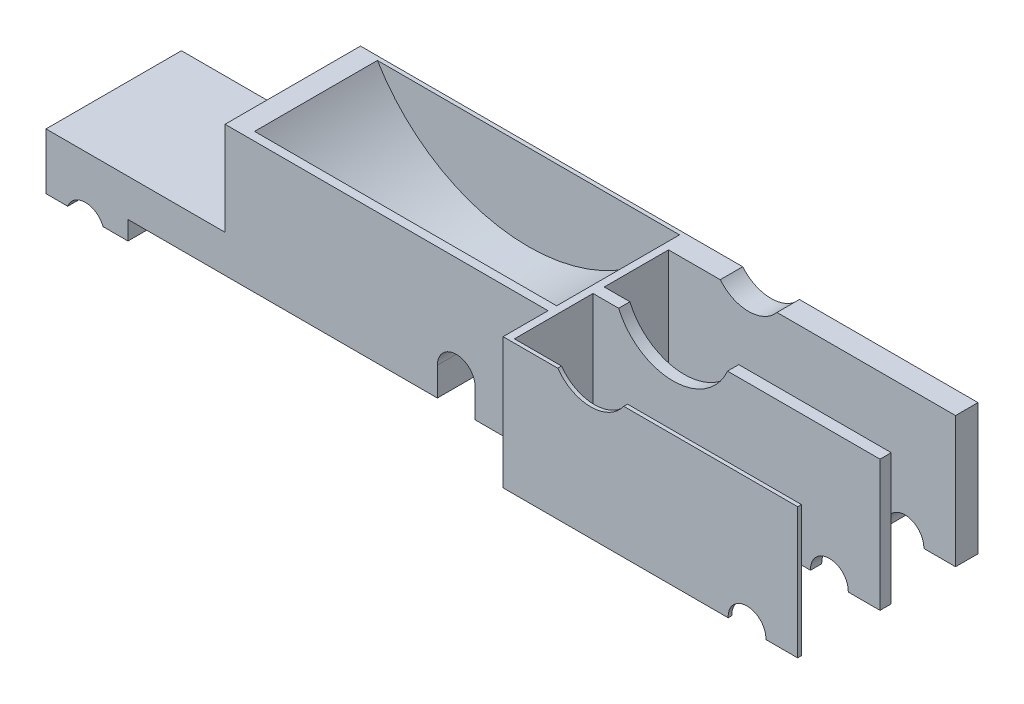
ISO-10303-21;
HEADER;
FILE_DESCRIPTION(('STEP AP214'),'2;1');
FILE_NAME('part.step','',(''),(''),'','','');
FILE_SCHEMA(('AUTOMOTIVE_DESIGN { 1 0 10303 214 1 1 1 1 }'));
ENDSEC;
DATA;
#1=APPLICATION_CONTEXT('core data for automotive mechanical design processes');
#2=APPLICATION_PROTOCOL_DEFINITION('international standard','automotive_design',2000,#1);
#3=PRODUCT_CONTEXT('',#1,'mechanical');
#4=PRODUCT('Part','Part','',(#3));
#5=PRODUCT_RELATED_PRODUCT_CATEGORY('part','',(#4));
#6=PRODUCT_DEFINITION_FORMATION('','',#4);
#7=PRODUCT_DEFINITION_CONTEXT('part definition',#1,'design');
#8=PRODUCT_DEFINITION('design','',#6,#7);
#9=PRODUCT_DEFINITION_SHAPE('','',#8);
#10=(LENGTH_UNIT() NAMED_UNIT(*) SI_UNIT(.MILLI.,.METRE.));
#11=(NAMED_UNIT(*) PLANE_ANGLE_UNIT() SI_UNIT($,.RADIAN.));
#12=(NAMED_UNIT(*) SI_UNIT($,.STERADIAN.) SOLID_ANGLE_UNIT());
#13=UNCERTAINTY_MEASURE_WITH_UNIT(LENGTH_MEASURE(1.E-05),#10,'distance_accuracy_value','');
#14=(GEOMETRIC_REPRESENTATION_CONTEXT(3) GLOBAL_UNCERTAINTY_ASSIGNED_CONTEXT((#13)) GLOBAL_UNIT_ASSIGNED_CONTEXT((#10,
#11,#12)) REPRESENTATION_CONTEXT('',''));
#15=CARTESIAN_POINT('',(0.,0.,0.));
#16=DIRECTION('',(0.,0.,1.));
#17=DIRECTION('',(1.,0.,0.));
#18=AXIS2_PLACEMENT_3D('',#15,#16,#17);
#19=CARTESIAN_POINT('',(0.,0.,0.));
#20=DIRECTION('',(0.,-1.,0.));
#21=DIRECTION('',(0.,0.,-1.));
#22=AXIS2_PLACEMENT_3D('',#19,#20,#21);
#23=PLANE('',#22);
#24=DIRECTION('',(0.,0.,-1.));
#25=VECTOR('',#24,1.);
#26=CARTESIAN_POINT('',(371.919967655531,0.,-11.94308));
#27=LINE('',#26,#25);
#28=CARTESIAN_POINT('',(371.919967655531,0.,-11.94308));
#29=VERTEX_POINT('',#28);
#30=CARTESIAN_POINT('',(371.919967655531,0.,-14.48308));
#31=VERTEX_POINT('',#30);
#32=EDGE_CURVE('E342',#29,#31,#27,.T.);
#33=ORIENTED_EDGE('',*,*,#32,.F.);
#34=DIRECTION('',(1.,0.,0.));
#35=VECTOR('',#34,1.);
#36=CARTESIAN_POINT('',(0.,0.,-11.94308));
#37=LINE('',#36,#35);
#38=CARTESIAN_POINT('',(219.202,0.,-11.94308));
#39=VERTEX_POINT('',#38);
#40=EDGE_CURVE('E432',#39,#29,#37,.T.);
#41=ORIENTED_EDGE('',*,*,#40,.F.);
#42=DIRECTION('',(0.,0.,1.));
#43=VECTOR('',#42,1.);
#44=CARTESIAN_POINT('',(219.202,0.,-42.42308));
#45=LINE('',#44,#43);
#46=CARTESIAN_POINT('',(219.202,0.,-42.42308));
#47=VERTEX_POINT('',#46);
#48=EDGE_CURVE('E422',#47,#39,#45,.T.);
#49=ORIENTED_EDGE('',*,*,#48,.F.);
#50=DIRECTION('',(1.,0.,0.));
#51=VECTOR('',#50,1.);
#52=CARTESIAN_POINT('',(0.,0.,-42.42308));
#53=LINE('',#52,#51);
#54=CARTESIAN_POINT('',(169.736021606867,0.,-42.42308));
#55=VERTEX_POINT('',#54);
#56=EDGE_CURVE('E410',#55,#47,#53,.T.);
#57=ORIENTED_EDGE('',*,*,#56,.F.);
#58=DIRECTION('',(0.,0.,-1.));
#59=VECTOR('',#58,1.);
#60=CARTESIAN_POINT('',(169.736021606867,0.,-11.94308));
#61=LINE('',#60,#59);
#62=CARTESIAN_POINT('',(169.736021606867,0.,-134.33298));
#63=VERTEX_POINT('',#62);
#64=EDGE_CURVE('E640',#55,#63,#61,.T.);
#65=ORIENTED_EDGE('',*,*,#64,.T.);
#66=DIRECTION('',(-1.,0.,0.));
#67=VECTOR('',#66,1.);
#68=CARTESIAN_POINT('',(419.1,0.,-134.33298));
#69=LINE('',#68,#67);
#70=CARTESIAN_POINT('',(371.919967655531,0.,-134.33298));
#71=VERTEX_POINT('',#70);
#72=EDGE_CURVE('E452',#71,#63,#69,.T.);
#73=ORIENTED_EDGE('',*,*,#72,.F.);
#74=CARTESIAN_POINT('',(371.919967655531,0.,-119.09298));
#75=VERTEX_POINT('',#74);
#76=EDGE_CURVE('E69',#75,#71,#27,.T.);
#77=ORIENTED_EDGE('',*,*,#76,.F.);
#78=DIRECTION('',(-1.,0.,0.));
#79=VECTOR('',#78,1.);
#80=CARTESIAN_POINT('',(419.1,0.,-119.09298));
#81=LINE('',#80,#79);
#82=CARTESIAN_POINT('',(224.319280820751,0.,-119.09298));
#83=VERTEX_POINT('',#82);
#84=EDGE_CURVE('E505',#75,#83,#81,.T.);
#85=ORIENTED_EDGE('',*,*,#84,.T.);
#86=DIRECTION('',(0.,0.,1.));
#87=VECTOR('',#86,1.);
#88=CARTESIAN_POINT('',(224.319280820751,0.,-119.09298));
#89=LINE('',#88,#87);
#90=CARTESIAN_POINT('',(224.319280820751,0.,-75.45324));
#91=VERTEX_POINT('',#90);
#92=EDGE_CURVE('E504',#83,#91,#89,.T.);
#93=ORIENTED_EDGE('',*,*,#92,.T.);
#94=DIRECTION('',(1.,0.,0.));
#95=VECTOR('',#94,1.);
#96=CARTESIAN_POINT('',(224.319280820751,0.,-75.45324));
#97=LINE('',#96,#95);
#98=CARTESIAN_POINT('',(371.919967655531,0.,-75.45324));
#99=VERTEX_POINT('',#98);
#100=EDGE_CURVE('E510',#91,#99,#97,.T.);
#101=ORIENTED_EDGE('',*,*,#100,.T.);
#102=CARTESIAN_POINT('',(371.919967655531,0.,-67.83324));
#103=VERTEX_POINT('',#102);
#104=EDGE_CURVE('E61',#103,#99,#27,.T.);
#105=ORIENTED_EDGE('',*,*,#104,.F.);
#106=DIRECTION('',(-1.,0.,0.));
#107=VECTOR('',#106,1.);
#108=CARTESIAN_POINT('',(419.1,0.,-67.83324));
#109=LINE('',#108,#107);
#110=CARTESIAN_POINT('',(224.319280820751,0.,-67.83324));
#111=VERTEX_POINT('',#110);
#112=EDGE_CURVE('E546',#103,#111,#109,.T.);
#113=ORIENTED_EDGE('',*,*,#112,.T.);
#114=DIRECTION('',(0.,0.,1.));
#115=VECTOR('',#114,1.);
#116=CARTESIAN_POINT('',(224.319280820751,0.,-67.83324));
#117=LINE('',#116,#115);
#118=CARTESIAN_POINT('',(224.319280820751,0.,-14.48308));
#119=VERTEX_POINT('',#118);
#120=EDGE_CURVE('E580',#111,#119,#117,.T.);
#121=ORIENTED_EDGE('',*,*,#120,.T.);
#122=DIRECTION('',(1.,0.,0.));
#123=VECTOR('',#122,1.);
#124=CARTESIAN_POINT('',(224.319280820751,0.,-14.48308));
#125=LINE('',#124,#123);
#126=EDGE_CURVE('E576',#119,#31,#125,.T.);
#127=ORIENTED_EDGE('',*,*,#126,.T.);
#128=EDGE_LOOP('',(#33,#41,#49,#57,#65,#73,#77,#85,#93,#101,#105,#113,#121,#127));
#129=FACE_BOUND('',#128,.T.);
#130=ADVANCED_FACE('F45',(#129),#23,.T.);
#131=DIRECTION('',(0.,0.,-1.));
#132=VECTOR('',#131,1.);
#133=CARTESIAN_POINT('',(397.551903334925,0.,-11.94308));
#134=LINE('',#133,#132);
#135=CARTESIAN_POINT('',(397.551903334925,0.,-134.33298));
#136=VERTEX_POINT('',#135);
#137=CARTESIAN_POINT('',(397.551903334925,0.,-119.09298));
#138=VERTEX_POINT('',#137);
#139=EDGE_CURVE('E334',#136,#138,#134,.F.);
#140=ORIENTED_EDGE('',*,*,#139,.F.);
#141=CARTESIAN_POINT('',(419.1,0.,-134.33298));
#142=VERTEX_POINT('',#141);
#143=EDGE_CURVE('E447',#142,#136,#69,.T.);
#144=ORIENTED_EDGE('',*,*,#143,.F.);
#145=DIRECTION('',(0.,0.,-1.));
#146=VECTOR('',#145,1.);
#147=CARTESIAN_POINT('',(419.1,0.,0.));
#148=LINE('',#147,#146);
#149=CARTESIAN_POINT('',(419.1,0.,-119.09298));
#150=VERTEX_POINT('',#149);
#151=EDGE_CURVE('E588',#150,#142,#148,.T.);
#152=ORIENTED_EDGE('',*,*,#151,.F.);
#153=EDGE_CURVE('E500',#150,#138,#81,.T.);
#154=ORIENTED_EDGE('',*,*,#153,.T.);
#155=EDGE_LOOP('',(#140,#144,#152,#154));
#156=FACE_BOUND('',#155,.T.);
#157=ADVANCED_FACE('F734',(#156),#23,.T.);
#158=CARTESIAN_POINT('',(397.551903334925,0.,-75.45324));
#159=VERTEX_POINT('',#158);
#160=CARTESIAN_POINT('',(397.551903334925,0.,-67.83324));
#161=VERTEX_POINT('',#160);
#162=EDGE_CURVE('E338',#159,#161,#134,.F.);
#163=ORIENTED_EDGE('',*,*,#162,.F.);
#164=CARTESIAN_POINT('',(419.1,0.,-75.45324));
#165=VERTEX_POINT('',#164);
#166=EDGE_CURVE('E509',#159,#165,#97,.T.);
#167=ORIENTED_EDGE('',*,*,#166,.T.);
#168=CARTESIAN_POINT('',(419.1,0.,-67.83324));
#169=VERTEX_POINT('',#168);
#170=EDGE_CURVE('E606',#169,#165,#148,.T.);
#171=ORIENTED_EDGE('',*,*,#170,.F.);
#172=EDGE_CURVE('E571',#169,#161,#109,.T.);
#173=ORIENTED_EDGE('',*,*,#172,.T.);
#174=EDGE_LOOP('',(#163,#167,#171,#173));
#175=FACE_BOUND('',#174,.T.);
#176=ADVANCED_FACE('F717',(#175),#23,.T.);
#177=DIRECTION('',(0.,0.,-1.));
#178=VECTOR('',#177,1.);
#179=CARTESIAN_POINT('',(144.082021606867,0.,-11.94308));
#180=LINE('',#179,#178);
#181=CARTESIAN_POINT('',(144.082021606867,0.,-42.42308));
#182=VERTEX_POINT('',#181);
#183=CARTESIAN_POINT('',(144.082021606867,0.,-134.33298));
#184=VERTEX_POINT('',#183);
#185=EDGE_CURVE('E302',#182,#184,#180,.T.);
#186=ORIENTED_EDGE('',*,*,#185,.F.);
#187=CARTESIAN_POINT('',(-65.8864784217989,0.,-42.42308));
#188=VERTEX_POINT('',#187);
#189=EDGE_CURVE('E411',#188,#182,#53,.T.);
#190=ORIENTED_EDGE('',*,*,#189,.F.);
#191=DIRECTION('',(0.,0.,1.));
#192=VECTOR('',#191,1.);
#193=CARTESIAN_POINT('',(-65.8864784217989,0.,-42.42308));
#194=LINE('',#193,#192);
#195=CARTESIAN_POINT('',(-65.8864784217989,0.,-134.33298));
#196=VERTEX_POINT('',#195);
#197=EDGE_CURVE('E358',#196,#188,#194,.T.);
#198=ORIENTED_EDGE('',*,*,#197,.F.);
#199=EDGE_CURVE('E446',#184,#196,#69,.T.);
#200=ORIENTED_EDGE('',*,*,#199,.F.);
#201=EDGE_LOOP('',(#186,#190,#198,#200));
#202=FACE_BOUND('',#201,.T.);
#203=ADVANCED_FACE('F637',(#202),#23,.T.);
#204=CARTESIAN_POINT('',(0.,-12.7,0.));
#205=DIRECTION('',(0.,-1.,0.));
#206=DIRECTION('',(0.,0.,-1.));
#207=AXIS2_PLACEMENT_3D('',#204,#205,#206);
#208=PLANE('',#207);
#209=DIRECTION('',(0.,0.,-1.));
#210=VECTOR('',#209,1.);
#211=CARTESIAN_POINT('',(-106.78265671688,-12.7,-11.94308));
#212=LINE('',#211,#210);
#213=CARTESIAN_POINT('',(-106.78265671688,-12.7,-42.42308));
#214=VERTEX_POINT('',#213);
#215=CARTESIAN_POINT('',(-106.78265671688,-12.7,-134.33298));
#216=VERTEX_POINT('',#215);
#217=EDGE_CURVE('E627',#214,#216,#212,.T.);
#218=ORIENTED_EDGE('',*,*,#217,.F.);
#219=DIRECTION('',(-1.,0.,0.));
#220=VECTOR('',#219,1.);
#221=CARTESIAN_POINT('',(-121.533574186181,-12.7,-42.42308));
#222=LINE('',#221,#220);
#223=CARTESIAN_POINT('',(-121.533574186181,-12.7,-42.42308));
#224=VERTEX_POINT('',#223);
#225=EDGE_CURVE('E366',#214,#224,#222,.T.);
#226=ORIENTED_EDGE('',*,*,#225,.T.);
#227=DIRECTION('',(0.,0.,-1.));
#228=VECTOR('',#227,1.);
#229=CARTESIAN_POINT('',(-121.533574186181,-12.7,-42.42308));
#230=LINE('',#229,#228);
#231=CARTESIAN_POINT('',(-121.533574186181,-12.7,-134.33298));
#232=VERTEX_POINT('',#231);
#233=EDGE_CURVE('E353',#224,#232,#230,.T.);
#234=ORIENTED_EDGE('',*,*,#233,.T.);
#235=DIRECTION('',(1.,0.,0.));
#236=VECTOR('',#235,1.);
#237=CARTESIAN_POINT('',(-121.533574186181,-12.7,-134.33298));
#238=LINE('',#237,#236);
#239=EDGE_CURVE('E359',#232,#216,#238,.T.);
#240=ORIENTED_EDGE('',*,*,#239,.T.);
#241=EDGE_LOOP('',(#218,#226,#234,#240));
#242=FACE_BOUND('',#241,.T.);
#243=ADVANCED_FACE('F700',(#242),#208,.T.);
#244=CARTESIAN_POINT('',(0.,88.9,0.));
#245=DIRECTION('',(1.,0.,0.));
#246=DIRECTION('',(0.,0.,-1.));
#247=AXIS2_PLACEMENT_3D('',#244,#245,#246);
#248=PLANE('',#247);
#249=DIRECTION('',(0.,1.,0.));
#250=VECTOR('',#249,1.);
#251=CARTESIAN_POINT('',(0.,88.9,-134.33298));
#252=LINE('',#251,#250);
#253=CARTESIAN_POINT('',(0.,25.4,-134.33298));
#254=VERTEX_POINT('',#253);
#255=CARTESIAN_POINT('',(0.,88.9,-134.33298));
#256=VERTEX_POINT('',#255);
#257=EDGE_CURVE('E451',#254,#256,#252,.T.);
#258=ORIENTED_EDGE('',*,*,#257,.F.);
#259=DIRECTION('',(0.,0.,1.));
#260=VECTOR('',#259,1.);
#261=CARTESIAN_POINT('',(0.,25.4,-42.42308));
#262=LINE('',#261,#260);
#263=CARTESIAN_POINT('',(0.,25.4,-42.42308));
#264=VERTEX_POINT('',#263);
#265=EDGE_CURVE('E382',#254,#264,#262,.T.);
#266=ORIENTED_EDGE('',*,*,#265,.T.);
#267=DIRECTION('',(0.,-1.,0.));
#268=VECTOR('',#267,1.);
#269=CARTESIAN_POINT('',(0.,88.9,-42.42308));
#270=LINE('',#269,#268);
#271=CARTESIAN_POINT('',(0.,88.9,-42.42308));
#272=VERTEX_POINT('',#271);
#273=EDGE_CURVE('E406',#272,#264,#270,.T.);
#274=ORIENTED_EDGE('',*,*,#273,.F.);
#275=DIRECTION('',(0.,0.,1.));
#276=VECTOR('',#275,1.);
#277=CARTESIAN_POINT('',(0.,88.9,0.));
#278=LINE('',#277,#276);
#279=EDGE_CURVE('E592',#256,#272,#278,.T.);
#280=ORIENTED_EDGE('',*,*,#279,.F.);
#281=EDGE_LOOP('',(#258,#266,#274,#280));
#282=FACE_BOUND('',#281,.T.);
#283=ADVANCED_FACE('F47',(#282),#248,.F.);
#284=CARTESIAN_POINT('',(0.,88.9,0.));
#285=DIRECTION('',(0.,-1.,0.));
#286=DIRECTION('',(0.,0.,-1.));
#287=AXIS2_PLACEMENT_3D('',#284,#285,#286);
#288=PLANE('',#287);
#289=DIRECTION('',(-1.,0.,0.));
#290=VECTOR('',#289,1.);
#291=CARTESIAN_POINT('',(0.,88.9,-11.94308));
#292=LINE('',#291,#290);
#293=CARTESIAN_POINT('',(419.1,88.9,-11.94308));
#294=VERTEX_POINT('',#293);
#295=CARTESIAN_POINT('',(301.050585943135,88.9,-11.94308));
#296=VERTEX_POINT('',#295);
#297=EDGE_CURVE('E440',#294,#296,#292,.T.);
#298=ORIENTED_EDGE('',*,*,#297,.F.);
#299=DIRECTION('',(0.,0.,-1.));
#300=VECTOR('',#299,1.);
#301=CARTESIAN_POINT('',(419.1,88.9,0.));
#302=LINE('',#301,#300);
#303=CARTESIAN_POINT('',(419.1,88.9,-14.48308));
#304=VERTEX_POINT('',#303);
#305=EDGE_CURVE('E598',#294,#304,#302,.T.);
#306=ORIENTED_EDGE('',*,*,#305,.T.);
#307=DIRECTION('',(1.,0.,0.));
#308=VECTOR('',#307,1.);
#309=CARTESIAN_POINT('',(224.319280820751,88.9,-14.48308));
#310=LINE('',#309,#308);
#311=CARTESIAN_POINT('',(301.050585943135,88.9,-14.48308));
#312=VERTEX_POINT('',#311);
#313=EDGE_CURVE('E561',#312,#304,#310,.T.);
#314=ORIENTED_EDGE('',*,*,#313,.F.);
#315=DIRECTION('',(0.,0.,-1.));
#316=VECTOR('',#315,1.);
#317=CARTESIAN_POINT('',(301.050585943135,88.9,-11.94308));
#318=LINE('',#317,#316);
#319=EDGE_CURVE('E463',#312,#296,#318,.F.);
#320=ORIENTED_EDGE('',*,*,#319,.T.);
#321=EDGE_LOOP('',(#298,#306,#314,#320));
#322=FACE_BOUND('',#321,.T.);
#323=ADVANCED_FACE('F789',(#322),#288,.F.);
#324=DIRECTION('',(1.,0.,0.));
#325=VECTOR('',#324,1.);
#326=CARTESIAN_POINT('',(0.,88.9,-48.23206));
#327=LINE('',#326,#325);
#328=CARTESIAN_POINT('',(14.1940189788362,88.9,-48.23206));
#329=VERTEX_POINT('',#328);
#330=CARTESIAN_POINT('',(219.239280820751,88.9,-48.23206));
#331=VERTEX_POINT('',#330);
#332=EDGE_CURVE('E618',#329,#331,#327,.T.);
#333=ORIENTED_EDGE('',*,*,#332,.F.);
#334=DIRECTION('',(0.,0.,-1.));
#335=VECTOR('',#334,1.);
#336=CARTESIAN_POINT('',(14.1940189788362,88.9,-48.23206));
#337=LINE('',#336,#335);
#338=CARTESIAN_POINT('',(14.1940189788362,88.9,-131.63296));
#339=VERTEX_POINT('',#338);
#340=EDGE_CURVE('E614',#329,#339,#337,.T.);
#341=ORIENTED_EDGE('',*,*,#340,.T.);
#342=DIRECTION('',(1.,0.,0.));
#343=VECTOR('',#342,1.);
#344=CARTESIAN_POINT('',(0.,88.9,-131.63296));
#345=LINE('',#344,#343);
#346=CARTESIAN_POINT('',(219.239280820751,88.9,-131.63296));
#347=VERTEX_POINT('',#346);
#348=EDGE_CURVE('E601',#339,#347,#345,.T.);
#349=ORIENTED_EDGE('',*,*,#348,.T.);
#350=DIRECTION('',(0.,0.,-1.));
#351=VECTOR('',#350,1.);
#352=CARTESIAN_POINT('',(219.239280820751,88.9,-48.23206));
#353=LINE('',#352,#351);
#354=EDGE_CURVE('E610',#347,#331,#353,.F.);
#355=ORIENTED_EDGE('',*,*,#354,.T.);
#356=EDGE_LOOP('',(#333,#341,#349,#355));
#357=FACE_BOUND('',#356,.T.);
#358=DIRECTION('',(-1.,0.,0.));
#359=VECTOR('',#358,1.);
#360=CARTESIAN_POINT('',(0.,88.9,-42.42308));
#361=LINE('',#360,#359);
#362=CARTESIAN_POINT('',(219.202,88.9,-42.42308));
#363=VERTEX_POINT('',#362);
#364=EDGE_CURVE('E419',#363,#272,#361,.T.);
#365=ORIENTED_EDGE('',*,*,#364,.F.);
#366=DIRECTION('',(0.,0.,1.));
#367=VECTOR('',#366,1.);
#368=CARTESIAN_POINT('',(219.202,88.9,-42.42308));
#369=LINE('',#368,#367);
#370=CARTESIAN_POINT('',(219.202,88.9,-11.94308));
#371=VERTEX_POINT('',#370);
#372=EDGE_CURVE('E425',#363,#371,#369,.T.);
#373=ORIENTED_EDGE('',*,*,#372,.T.);
#374=CARTESIAN_POINT('',(256.248118226236,88.9,-11.94308));
#375=VERTEX_POINT('',#374);
#376=EDGE_CURVE('E439',#375,#371,#292,.T.);
#377=ORIENTED_EDGE('',*,*,#376,.F.);
#378=DIRECTION('',(0.,0.,-1.));
#379=VECTOR('',#378,1.);
#380=CARTESIAN_POINT('',(256.248118226236,88.9,-11.94308));
#381=LINE('',#380,#379);
#382=CARTESIAN_POINT('',(256.248118226236,88.9,-14.48308));
#383=VERTEX_POINT('',#382);
#384=EDGE_CURVE('E469',#375,#383,#381,.T.);
#385=ORIENTED_EDGE('',*,*,#384,.T.);
#386=CARTESIAN_POINT('',(224.319280820751,88.9,-14.48308));
#387=VERTEX_POINT('',#386);
#388=EDGE_CURVE('E563',#387,#383,#310,.T.);
#389=ORIENTED_EDGE('',*,*,#388,.F.);
#390=DIRECTION('',(0.,0.,1.));
#391=VECTOR('',#390,1.);
#392=CARTESIAN_POINT('',(224.319280820751,88.9,-67.83324));
#393=LINE('',#392,#391);
#394=CARTESIAN_POINT('',(224.319280820751,88.9,-67.83324));
#395=VERTEX_POINT('',#394);
#396=EDGE_CURVE('E567',#395,#387,#393,.T.);
#397=ORIENTED_EDGE('',*,*,#396,.F.);
#398=DIRECTION('',(-1.,0.,0.));
#399=VECTOR('',#398,1.);
#400=CARTESIAN_POINT('',(419.1,88.9,-67.83324));
#401=LINE('',#400,#399);
#402=CARTESIAN_POINT('',(241.695262553801,88.9,-67.83324));
#403=VERTEX_POINT('',#402);
#404=EDGE_CURVE('E562',#403,#395,#401,.T.);
#405=ORIENTED_EDGE('',*,*,#404,.F.);
#406=DIRECTION('',(0.,0.,1.));
#407=VECTOR('',#406,1.);
#408=CARTESIAN_POINT('',(241.695262553801,88.9,-77.83324));
#409=LINE('',#408,#407);
#410=CARTESIAN_POINT('',(241.695262553801,88.9,-75.45324));
#411=VERTEX_POINT('',#410);
#412=EDGE_CURVE('E477',#411,#403,#409,.T.);
#413=ORIENTED_EDGE('',*,*,#412,.F.);
#414=DIRECTION('',(1.,0.,0.));
#415=VECTOR('',#414,1.);
#416=CARTESIAN_POINT('',(224.319280820751,88.9,-75.45324));
#417=LINE('',#416,#415);
#418=CARTESIAN_POINT('',(224.319280820751,88.9,-75.45324));
#419=VERTEX_POINT('',#418);
#420=EDGE_CURVE('E525',#419,#411,#417,.T.);
#421=ORIENTED_EDGE('',*,*,#420,.F.);
#422=DIRECTION('',(0.,0.,1.));
#423=VECTOR('',#422,1.);
#424=CARTESIAN_POINT('',(224.319280820751,88.9,-119.09298));
#425=LINE('',#424,#423);
#426=CARTESIAN_POINT('',(224.319280820751,88.9,-119.09298));
#427=VERTEX_POINT('',#426);
#428=EDGE_CURVE('E519',#427,#419,#425,.T.);
#429=ORIENTED_EDGE('',*,*,#428,.F.);
#430=DIRECTION('',(-1.,0.,0.));
#431=VECTOR('',#430,1.);
#432=CARTESIAN_POINT('',(419.1,88.9,-119.09298));
#433=LINE('',#432,#431);
#434=CARTESIAN_POINT('',(259.400173451636,88.9,-119.09298));
#435=VERTEX_POINT('',#434);
#436=EDGE_CURVE('E520',#435,#427,#433,.T.);
#437=ORIENTED_EDGE('',*,*,#436,.F.);
#438=DIRECTION('',(0.,0.,-1.));
#439=VECTOR('',#438,1.);
#440=CARTESIAN_POINT('',(259.400173451636,88.9,-119.09298));
#441=LINE('',#440,#439);
#442=CARTESIAN_POINT('',(259.400173451636,88.9,-134.33298));
#443=VERTEX_POINT('',#442);
#444=EDGE_CURVE('E495',#435,#443,#441,.T.);
#445=ORIENTED_EDGE('',*,*,#444,.T.);
#446=DIRECTION('',(1.,0.,0.));
#447=VECTOR('',#446,1.);
#448=CARTESIAN_POINT('',(419.1,88.9,-134.33298));
#449=LINE('',#448,#447);
#450=EDGE_CURVE('E456',#256,#443,#449,.T.);
#451=ORIENTED_EDGE('',*,*,#450,.F.);
#452=ORIENTED_EDGE('',*,*,#279,.T.);
#453=EDGE_LOOP('',(#365,#373,#377,#385,#389,#397,#405,#413,#421,#429,#437,#445,#451,#452));
#454=FACE_BOUND('',#453,.T.);
#455=ADVANCED_FACE('F682',(#357,#454),#288,.F.);
#456=CARTESIAN_POINT('',(397.551903334925,0.,-14.48308));
#457=VERTEX_POINT('',#456);
#458=CARTESIAN_POINT('',(397.551903334925,0.,-11.94308));
#459=VERTEX_POINT('',#458);
#460=EDGE_CURVE('E337',#457,#459,#134,.F.);
#461=ORIENTED_EDGE('',*,*,#460,.F.);
#462=CARTESIAN_POINT('',(419.1,0.,-14.48308));
#463=VERTEX_POINT('',#462);
#464=EDGE_CURVE('E575',#457,#463,#125,.T.);
#465=ORIENTED_EDGE('',*,*,#464,.T.);
#466=CARTESIAN_POINT('',(419.1,0.,-11.94308));
#467=VERTEX_POINT('',#466);
#468=EDGE_CURVE('E597',#467,#463,#148,.T.);
#469=ORIENTED_EDGE('',*,*,#468,.F.);
#470=EDGE_CURVE('E429',#459,#467,#37,.T.);
#471=ORIENTED_EDGE('',*,*,#470,.F.);
#472=EDGE_LOOP('',(#461,#465,#469,#471));
#473=FACE_BOUND('',#472,.T.);
#474=ADVANCED_FACE('F778',(#473),#23,.T.);
#475=CARTESIAN_POINT('',(419.1,88.9,0.));
#476=DIRECTION('',(-1.,0.,0.));
#477=DIRECTION('',(0.,0.,1.));
#478=AXIS2_PLACEMENT_3D('',#475,#476,#477);
#479=PLANE('',#478);
#480=DIRECTION('',(0.,1.,0.));
#481=VECTOR('',#480,1.);
#482=CARTESIAN_POINT('',(419.1,88.9,-11.94308));
#483=LINE('',#482,#481);
#484=EDGE_CURVE('E436',#467,#294,#483,.T.);
#485=ORIENTED_EDGE('',*,*,#484,.F.);
#486=ORIENTED_EDGE('',*,*,#468,.T.);
#487=DIRECTION('',(0.,1.,0.));
#488=VECTOR('',#487,1.);
#489=CARTESIAN_POINT('',(419.1,0.,-14.48308));
#490=LINE('',#489,#488);
#491=EDGE_CURVE('E547',#463,#304,#490,.T.);
#492=ORIENTED_EDGE('',*,*,#491,.T.);
#493=ORIENTED_EDGE('',*,*,#305,.F.);
#494=EDGE_LOOP('',(#485,#486,#492,#493));
#495=FACE_BOUND('',#494,.T.);
#496=ADVANCED_FACE('F786',(#495),#479,.F.);
#497=CARTESIAN_POINT('',(297.898530717735,88.9,-134.33298));
#498=VERTEX_POINT('',#497);
#499=CARTESIAN_POINT('',(419.1,88.9,-134.33298));
#500=VERTEX_POINT('',#499);
#501=EDGE_CURVE('E455',#498,#500,#449,.T.);
#502=ORIENTED_EDGE('',*,*,#501,.F.);
#503=DIRECTION('',(0.,0.,-1.));
#504=VECTOR('',#503,1.);
#505=CARTESIAN_POINT('',(297.898530717735,88.9,-119.09298));
#506=LINE('',#505,#504);
#507=CARTESIAN_POINT('',(297.898530717735,88.9,-119.09298));
#508=VERTEX_POINT('',#507);
#509=EDGE_CURVE('E488',#498,#508,#506,.F.);
#510=ORIENTED_EDGE('',*,*,#509,.T.);
#511=CARTESIAN_POINT('',(419.1,88.9,-119.09298));
#512=VERTEX_POINT('',#511);
#513=EDGE_CURVE('E515',#512,#508,#433,.T.);
#514=ORIENTED_EDGE('',*,*,#513,.F.);
#515=EDGE_CURVE('E596',#512,#500,#302,.T.);
#516=ORIENTED_EDGE('',*,*,#515,.T.);
#517=EDGE_LOOP('',(#502,#510,#514,#516));
#518=FACE_BOUND('',#517,.T.);
#519=ADVANCED_FACE('F819',(#518),#288,.F.);
#520=DIRECTION('',(0.,-1.,0.));
#521=VECTOR('',#520,1.);
#522=CARTESIAN_POINT('',(419.1,88.9,-134.33298));
#523=LINE('',#522,#521);
#524=EDGE_CURVE('E443',#500,#142,#523,.T.);
#525=ORIENTED_EDGE('',*,*,#524,.F.);
#526=ORIENTED_EDGE('',*,*,#515,.F.);
#527=DIRECTION('',(0.,1.,0.));
#528=VECTOR('',#527,1.);
#529=CARTESIAN_POINT('',(419.1,0.,-119.09298));
#530=LINE('',#529,#528);
#531=EDGE_CURVE('E514',#150,#512,#530,.T.);
#532=ORIENTED_EDGE('',*,*,#531,.F.);
#533=ORIENTED_EDGE('',*,*,#151,.T.);
#534=EDGE_LOOP('',(#525,#526,#532,#533));
#535=FACE_BOUND('',#534,.T.);
#536=ADVANCED_FACE('F728',(#535),#479,.F.);
#537=DIRECTION('',(0.,0.,1.));
#538=VECTOR('',#537,1.);
#539=CARTESIAN_POINT('',(315.60344161557,88.9,-77.83324));
#540=LINE('',#539,#538);
#541=CARTESIAN_POINT('',(315.60344161557,88.9,-67.83324));
#542=VERTEX_POINT('',#541);
#543=CARTESIAN_POINT('',(315.60344161557,88.9,-75.45324));
#544=VERTEX_POINT('',#543);
#545=EDGE_CURVE('E480',#542,#544,#540,.F.);
#546=ORIENTED_EDGE('',*,*,#545,.F.);
#547=CARTESIAN_POINT('',(419.1,88.9,-67.83324));
#548=VERTEX_POINT('',#547);
#549=EDGE_CURVE('E557',#548,#542,#401,.T.);
#550=ORIENTED_EDGE('',*,*,#549,.F.);
#551=CARTESIAN_POINT('',(419.1,88.9,-75.45324));
#552=VERTEX_POINT('',#551);
#553=EDGE_CURVE('E602',#548,#552,#302,.T.);
#554=ORIENTED_EDGE('',*,*,#553,.T.);
#555=EDGE_CURVE('E524',#544,#552,#417,.T.);
#556=ORIENTED_EDGE('',*,*,#555,.F.);
#557=EDGE_LOOP('',(#546,#550,#554,#556));
#558=FACE_BOUND('',#557,.T.);
#559=ADVANCED_FACE('F1000',(#558),#288,.F.);
#560=ORIENTED_EDGE('',*,*,#170,.T.);
#561=DIRECTION('',(0.,1.,0.));
#562=VECTOR('',#561,1.);
#563=CARTESIAN_POINT('',(419.1,0.,-75.45324));
#564=LINE('',#563,#562);
#565=EDGE_CURVE('E529',#165,#552,#564,.T.);
#566=ORIENTED_EDGE('',*,*,#565,.T.);
#567=ORIENTED_EDGE('',*,*,#553,.F.);
#568=DIRECTION('',(0.,1.,0.));
#569=VECTOR('',#568,1.);
#570=CARTESIAN_POINT('',(419.1,0.,-67.83324));
#571=LINE('',#570,#569);
#572=EDGE_CURVE('E551',#169,#548,#571,.T.);
#573=ORIENTED_EDGE('',*,*,#572,.F.);
#574=EDGE_LOOP('',(#560,#566,#567,#573));
#575=FACE_BOUND('',#574,.T.);
#576=ADVANCED_FACE('F820',(#575),#479,.F.);
#577=CARTESIAN_POINT('',(116.716649899794,150.061217687717,-48.23206));
#578=DIRECTION('',(0.,0.,-1.));
#579=DIRECTION('',(-1.,0.,0.));
#580=AXIS2_PLACEMENT_3D('',#577,#578,#579);
#581=CYLINDRICAL_SURFACE('',#580,119.379999999996);
#582=CARTESIAN_POINT('',(116.716649899794,150.061217687717,-48.23206));
#583=DIRECTION('',(0.,0.,-1.));
#584=DIRECTION('',(-1.,0.,0.));
#585=AXIS2_PLACEMENT_3D('',#582,#583,#584);
#586=CIRCLE('',#585,119.379999999996);
#587=EDGE_CURVE('E584',#331,#329,#586,.T.);
#588=ORIENTED_EDGE('',*,*,#587,.F.);
#589=ORIENTED_EDGE('',*,*,#354,.F.);
#590=CARTESIAN_POINT('',(116.716649899794,150.061217687717,-131.63296));
#591=DIRECTION('',(0.,0.,-1.));
#592=DIRECTION('',(-1.,0.,0.));
#593=AXIS2_PLACEMENT_3D('',#590,#591,#592);
#594=CIRCLE('',#593,119.379999999996);
#595=EDGE_CURVE('E533',#347,#339,#594,.T.);
#596=ORIENTED_EDGE('',*,*,#595,.T.);
#597=ORIENTED_EDGE('',*,*,#340,.F.);
#598=EDGE_LOOP('',(#588,#589,#596,#597));
#599=FACE_BOUND('',#598,.T.);
#600=ADVANCED_FACE('F1099',(#599),#581,.F.);
#601=CARTESIAN_POINT('',(116.716649899794,150.061217687717,-48.23206));
#602=DIRECTION('',(0.,0.,-1.));
#603=DIRECTION('',(-1.,0.,0.));
#604=AXIS2_PLACEMENT_3D('',#601,#602,#603);
#605=PLANE('',#604);
#606=ORIENTED_EDGE('',*,*,#332,.T.);
#607=ORIENTED_EDGE('',*,*,#587,.T.);
#608=EDGE_LOOP('',(#606,#607));
#609=FACE_BOUND('',#608,.T.);
#610=ADVANCED_FACE('F1106',(#609),#605,.T.);
#611=CARTESIAN_POINT('',(116.716649899794,150.061217687717,-131.63296));
#612=DIRECTION('',(0.,0.,-1.));
#613=DIRECTION('',(-1.,0.,0.));
#614=AXIS2_PLACEMENT_3D('',#611,#612,#613);
#615=PLANE('',#614);
#616=ORIENTED_EDGE('',*,*,#595,.F.);
#617=ORIENTED_EDGE('',*,*,#348,.F.);
#618=EDGE_LOOP('',(#616,#617));
#619=FACE_BOUND('',#618,.T.);
#620=ADVANCED_FACE('F1091',(#619),#615,.F.);
#621=CARTESIAN_POINT('',(224.319280820751,0.,-67.83324));
#622=DIRECTION('',(-1.,0.,0.));
#623=DIRECTION('',(0.,0.,1.));
#624=AXIS2_PLACEMENT_3D('',#621,#622,#623);
#625=PLANE('',#624);
#626=ORIENTED_EDGE('',*,*,#396,.T.);
#627=DIRECTION('',(0.,1.,0.));
#628=VECTOR('',#627,1.);
#629=CARTESIAN_POINT('',(224.319280820751,0.,-14.48308));
#630=LINE('',#629,#628);
#631=EDGE_CURVE('E543',#119,#387,#630,.T.);
#632=ORIENTED_EDGE('',*,*,#631,.F.);
#633=ORIENTED_EDGE('',*,*,#120,.F.);
#634=DIRECTION('',(0.,1.,0.));
#635=VECTOR('',#634,1.);
#636=CARTESIAN_POINT('',(224.319280820751,0.,-67.83324));
#637=LINE('',#636,#635);
#638=EDGE_CURVE('E499',#111,#395,#637,.T.);
#639=ORIENTED_EDGE('',*,*,#638,.T.);
#640=EDGE_LOOP('',(#626,#632,#633,#639));
#641=FACE_BOUND('',#640,.T.);
#642=ADVANCED_FACE('F767',(#641),#625,.F.);
#643=CARTESIAN_POINT('',(419.1,0.,-67.83324));
#644=DIRECTION('',(0.,0.,-1.));
#645=DIRECTION('',(-1.,0.,0.));
#646=AXIS2_PLACEMENT_3D('',#643,#644,#645);
#647=PLANE('',#646);
#648=ORIENTED_EDGE('',*,*,#112,.F.);
#649=CARTESIAN_POINT('',(384.735935495228,0.531880937664542,-67.83324));
#650=DIRECTION('',(0.,0.,-1.));
#651=DIRECTION('',(-1.,0.,0.));
#652=AXIS2_PLACEMENT_3D('',#649,#650,#651);
#653=CIRCLE('',#652,12.827);
#654=EDGE_CURVE('E345',#103,#161,#653,.T.);
#655=ORIENTED_EDGE('',*,*,#654,.T.);
#656=ORIENTED_EDGE('',*,*,#172,.F.);
#657=ORIENTED_EDGE('',*,*,#572,.T.);
#658=ORIENTED_EDGE('',*,*,#549,.T.);
#659=CARTESIAN_POINT('',(278.649352084686,104.852009966003,-67.83324));
#660=DIRECTION('',(0.,0.,-1.));
#661=DIRECTION('',(-1.,0.,0.));
#662=AXIS2_PLACEMENT_3D('',#659,#660,#661);
#663=CIRCLE('',#662,40.25011);
#664=EDGE_CURVE('E473',#542,#403,#663,.T.);
#665=ORIENTED_EDGE('',*,*,#664,.T.);
#666=ORIENTED_EDGE('',*,*,#404,.T.);
#667=ORIENTED_EDGE('',*,*,#638,.F.);
#668=EDGE_LOOP('',(#648,#655,#656,#657,#658,#665,#666,#667));
#669=FACE_BOUND('',#668,.T.);
#670=ADVANCED_FACE('F713',(#669),#647,.F.);
#671=CARTESIAN_POINT('',(224.319280820751,0.,-14.48308));
#672=DIRECTION('',(0.,0.,1.));
#673=DIRECTION('',(1.,0.,0.));
#674=AXIS2_PLACEMENT_3D('',#671,#672,#673);
#675=PLANE('',#674);
#676=ORIENTED_EDGE('',*,*,#464,.F.);
#677=CARTESIAN_POINT('',(384.735935495228,0.531880937664542,-14.48308));
#678=DIRECTION('',(0.,0.,1.));
#679=DIRECTION('',(1.,0.,0.));
#680=AXIS2_PLACEMENT_3D('',#677,#678,#679);
#681=CIRCLE('',#680,12.827);
#682=EDGE_CURVE('E349',#457,#31,#681,.T.);
#683=ORIENTED_EDGE('',*,*,#682,.T.);
#684=ORIENTED_EDGE('',*,*,#126,.F.);
#685=ORIENTED_EDGE('',*,*,#631,.T.);
#686=ORIENTED_EDGE('',*,*,#388,.T.);
#687=CARTESIAN_POINT('',(278.649352084686,104.852009966003,-14.48308));
#688=DIRECTION('',(0.,0.,-1.));
#689=DIRECTION('',(-1.,0.,0.));
#690=AXIS2_PLACEMENT_3D('',#687,#688,#689);
#691=CIRCLE('',#690,27.50058);
#692=EDGE_CURVE('E459',#312,#383,#691,.T.);
#693=ORIENTED_EDGE('',*,*,#692,.F.);
#694=ORIENTED_EDGE('',*,*,#313,.T.);
#695=ORIENTED_EDGE('',*,*,#491,.F.);
#696=EDGE_LOOP('',(#676,#683,#684,#685,#686,#693,#694,#695));
#697=FACE_BOUND('',#696,.T.);
#698=ADVANCED_FACE('F772',(#697),#675,.F.);
#699=CARTESIAN_POINT('',(224.319280820751,0.,-75.45324));
#700=DIRECTION('',(0.,0.,1.));
#701=DIRECTION('',(1.,0.,0.));
#702=AXIS2_PLACEMENT_3D('',#699,#700,#701);
#703=PLANE('',#702);
#704=ORIENTED_EDGE('',*,*,#166,.F.);
#705=CARTESIAN_POINT('',(384.735935495228,0.531880937664542,-75.45324));
#706=DIRECTION('',(0.,0.,1.));
#707=DIRECTION('',(1.,0.,0.));
#708=AXIS2_PLACEMENT_3D('',#705,#706,#707);
#709=CIRCLE('',#708,12.827);
#710=EDGE_CURVE('E341',#159,#99,#709,.T.);
#711=ORIENTED_EDGE('',*,*,#710,.T.);
#712=ORIENTED_EDGE('',*,*,#100,.F.);
#713=DIRECTION('',(0.,1.,0.));
#714=VECTOR('',#713,1.);
#715=CARTESIAN_POINT('',(224.319280820751,0.,-75.45324));
#716=LINE('',#715,#714);
#717=EDGE_CURVE('E534',#91,#419,#716,.T.);
#718=ORIENTED_EDGE('',*,*,#717,.T.);
#719=ORIENTED_EDGE('',*,*,#420,.T.);
#720=CARTESIAN_POINT('',(278.649352084686,104.852009966003,-75.45324));
#721=DIRECTION('',(0.,0.,1.));
#722=DIRECTION('',(1.,0.,0.));
#723=AXIS2_PLACEMENT_3D('',#720,#721,#722);
#724=CIRCLE('',#723,40.25011);
#725=EDGE_CURVE('E621',#544,#411,#724,.F.);
#726=ORIENTED_EDGE('',*,*,#725,.F.);
#727=ORIENTED_EDGE('',*,*,#555,.T.);
#728=ORIENTED_EDGE('',*,*,#565,.F.);
#729=EDGE_LOOP('',(#704,#711,#712,#718,#719,#726,#727,#728));
#730=FACE_BOUND('',#729,.T.);
#731=ADVANCED_FACE('F762',(#730),#703,.F.);
#732=CARTESIAN_POINT('',(224.319280820751,0.,-119.09298));
#733=DIRECTION('',(-1.,0.,0.));
#734=DIRECTION('',(0.,0.,1.));
#735=AXIS2_PLACEMENT_3D('',#732,#733,#734);
#736=PLANE('',#735);
#737=ORIENTED_EDGE('',*,*,#428,.T.);
#738=ORIENTED_EDGE('',*,*,#717,.F.);
#739=ORIENTED_EDGE('',*,*,#92,.F.);
#740=DIRECTION('',(0.,1.,0.));
#741=VECTOR('',#740,1.);
#742=CARTESIAN_POINT('',(224.319280820751,0.,-119.09298));
#743=LINE('',#742,#741);
#744=EDGE_CURVE('E537',#83,#427,#743,.T.);
#745=ORIENTED_EDGE('',*,*,#744,.T.);
#746=EDGE_LOOP('',(#737,#738,#739,#745));
#747=FACE_BOUND('',#746,.T.);
#748=ADVANCED_FACE('F752',(#747),#736,.F.);
#749=CARTESIAN_POINT('',(419.1,0.,-119.09298));
#750=DIRECTION('',(0.,0.,-1.));
#751=DIRECTION('',(-1.,0.,0.));
#752=AXIS2_PLACEMENT_3D('',#749,#750,#751);
#753=PLANE('',#752);
#754=ORIENTED_EDGE('',*,*,#84,.F.);
#755=CARTESIAN_POINT('',(384.735935495228,0.531880937664542,-119.09298));
#756=DIRECTION('',(0.,0.,-1.));
#757=DIRECTION('',(-1.,0.,0.));
#758=AXIS2_PLACEMENT_3D('',#755,#756,#757);
#759=CIRCLE('',#758,12.827);
#760=EDGE_CURVE('E330',#75,#138,#759,.T.);
#761=ORIENTED_EDGE('',*,*,#760,.T.);
#762=ORIENTED_EDGE('',*,*,#153,.F.);
#763=ORIENTED_EDGE('',*,*,#531,.T.);
#764=ORIENTED_EDGE('',*,*,#513,.T.);
#765=CARTESIAN_POINT('',(278.649352084686,104.852009966003,-119.09298));
#766=DIRECTION('',(0.,0.,-1.));
#767=DIRECTION('',(-1.,0.,0.));
#768=AXIS2_PLACEMENT_3D('',#765,#766,#767);
#769=CIRCLE('',#768,24.99995);
#770=EDGE_CURVE('E484',#508,#435,#769,.T.);
#771=ORIENTED_EDGE('',*,*,#770,.T.);
#772=ORIENTED_EDGE('',*,*,#436,.T.);
#773=ORIENTED_EDGE('',*,*,#744,.F.);
#774=EDGE_LOOP('',(#754,#761,#762,#763,#764,#771,#772,#773));
#775=FACE_BOUND('',#774,.T.);
#776=ADVANCED_FACE('F755',(#775),#753,.F.);
#777=CARTESIAN_POINT('',(278.649352084686,104.852009966003,-119.09298));
#778=DIRECTION('',(0.,0.,-1.));
#779=DIRECTION('',(-1.,0.,0.));
#780=AXIS2_PLACEMENT_3D('',#777,#778,#779);
#781=CYLINDRICAL_SURFACE('',#780,24.99995);
#782=ORIENTED_EDGE('',*,*,#770,.F.);
#783=ORIENTED_EDGE('',*,*,#509,.F.);
#784=CARTESIAN_POINT('',(278.649352084686,104.852009966003,-134.33298));
#785=DIRECTION('',(0.,0.,-1.));
#786=DIRECTION('',(-1.,0.,0.));
#787=AXIS2_PLACEMENT_3D('',#784,#785,#786);
#788=CIRCLE('',#787,24.99995);
#789=EDGE_CURVE('E483',#498,#443,#788,.T.);
#790=ORIENTED_EDGE('',*,*,#789,.T.);
#791=ORIENTED_EDGE('',*,*,#444,.F.);
#792=EDGE_LOOP('',(#782,#783,#790,#791));
#793=FACE_BOUND('',#792,.T.);
#794=ADVANCED_FACE('F804',(#793),#781,.F.);
#795=CARTESIAN_POINT('',(278.649352084686,104.852009966003,-77.83324));
#796=DIRECTION('',(0.,0.,1.));
#797=DIRECTION('',(1.,0.,0.));
#798=AXIS2_PLACEMENT_3D('',#795,#796,#797);
#799=CYLINDRICAL_SURFACE('',#798,40.25011);
#800=ORIENTED_EDGE('',*,*,#545,.T.);
#801=ORIENTED_EDGE('',*,*,#725,.T.);
#802=ORIENTED_EDGE('',*,*,#412,.T.);
#803=ORIENTED_EDGE('',*,*,#664,.F.);
#804=EDGE_LOOP('',(#800,#801,#802,#803));
#805=FACE_BOUND('',#804,.T.);
#806=ADVANCED_FACE('F795',(#805),#799,.F.);
#807=CARTESIAN_POINT('',(278.649352084686,104.852009966003,-11.94308));
#808=DIRECTION('',(0.,0.,-1.));
#809=DIRECTION('',(-1.,0.,0.));
#810=AXIS2_PLACEMENT_3D('',#807,#808,#809);
#811=CYLINDRICAL_SURFACE('',#810,27.50058);
#812=CARTESIAN_POINT('',(278.649352084686,104.852009966003,-11.94308));
#813=DIRECTION('',(0.,0.,-1.));
#814=DIRECTION('',(-1.,0.,0.));
#815=AXIS2_PLACEMENT_3D('',#812,#813,#814);
#816=CIRCLE('',#815,27.50058);
#817=EDGE_CURVE('E460',#296,#375,#816,.T.);
#818=ORIENTED_EDGE('',*,*,#817,.F.);
#819=ORIENTED_EDGE('',*,*,#319,.F.);
#820=ORIENTED_EDGE('',*,*,#692,.T.);
#821=ORIENTED_EDGE('',*,*,#384,.F.);
#822=EDGE_LOOP('',(#818,#819,#820,#821));
#823=FACE_BOUND('',#822,.T.);
#824=ADVANCED_FACE('F793',(#823),#811,.F.);
#825=CARTESIAN_POINT('',(0.,0.,-134.33298));
#826=DIRECTION('',(0.,0.,-1.));
#827=DIRECTION('',(-1.,0.,0.));
#828=AXIS2_PLACEMENT_3D('',#825,#826,#827);
#829=PLANE('',#828);
#830=CARTESIAN_POINT('',(384.735935495228,0.531880937664542,-134.33298));
#831=DIRECTION('',(0.,0.,-1.));
#832=DIRECTION('',(-1.,0.,0.));
#833=AXIS2_PLACEMENT_3D('',#830,#831,#832);
#834=CIRCLE('',#833,12.827);
#835=EDGE_CURVE('E318',#71,#136,#834,.T.);
#836=ORIENTED_EDGE('',*,*,#835,.F.);
#837=ORIENTED_EDGE('',*,*,#72,.T.);
#838=DIRECTION('',(0.,-1.,0.));
#839=VECTOR('',#838,1.);
#840=CARTESIAN_POINT('',(169.736021606867,19.3163774202701,-134.33298));
#841=LINE('',#840,#839);
#842=CARTESIAN_POINT('',(169.736021606867,19.3163774202701,-134.33298));
#843=VERTEX_POINT('',#842);
#844=EDGE_CURVE('E312',#843,#63,#841,.T.);
#845=ORIENTED_EDGE('',*,*,#844,.F.);
#846=CARTESIAN_POINT('',(156.909021606867,19.3163774202701,-134.33298));
#847=DIRECTION('',(0.,0.,-1.));
#848=DIRECTION('',(-1.,0.,0.));
#849=AXIS2_PLACEMENT_3D('',#846,#847,#848);
#850=CIRCLE('',#849,12.827);
#851=CARTESIAN_POINT('',(144.082021606867,19.3163774202701,-134.33298));
#852=VERTEX_POINT('',#851);
#853=EDGE_CURVE('E295',#852,#843,#850,.T.);
#854=ORIENTED_EDGE('',*,*,#853,.F.);
#855=DIRECTION('',(0.,1.,0.));
#856=VECTOR('',#855,1.);
#857=CARTESIAN_POINT('',(144.082021606867,0.,-134.33298));
#858=LINE('',#857,#856);
#859=EDGE_CURVE('E306',#184,#852,#858,.T.);
#860=ORIENTED_EDGE('',*,*,#859,.F.);
#861=ORIENTED_EDGE('',*,*,#199,.T.);
#862=DIRECTION('',(0.,1.,0.));
#863=VECTOR('',#862,1.);
#864=CARTESIAN_POINT('',(-65.8864784217989,-12.7,-134.33298));
#865=LINE('',#864,#863);
#866=CARTESIAN_POINT('',(-65.8864784217989,-12.7,-134.33298));
#867=VERTEX_POINT('',#866);
#868=EDGE_CURVE('E378',#867,#196,#865,.T.);
#869=ORIENTED_EDGE('',*,*,#868,.F.);
#870=CARTESIAN_POINT('',(-82.8151756705354,-12.7,-134.33298));
#871=VERTEX_POINT('',#870);
#872=EDGE_CURVE('E357',#871,#867,#238,.T.);
#873=ORIENTED_EDGE('',*,*,#872,.F.);
#874=CARTESIAN_POINT('',(-94.7989161937078,-17.2740454822043,-134.33298));
#875=DIRECTION('',(0.,0.,-1.));
#876=DIRECTION('',(-1.,0.,0.));
#877=AXIS2_PLACEMENT_3D('',#874,#875,#876);
#878=CIRCLE('',#877,12.827);
#879=EDGE_CURVE('E303',#216,#871,#878,.T.);
#880=ORIENTED_EDGE('',*,*,#879,.F.);
#881=ORIENTED_EDGE('',*,*,#239,.F.);
#882=DIRECTION('',(0.,-1.,0.));
#883=VECTOR('',#882,1.);
#884=CARTESIAN_POINT('',(-121.533574186181,25.4,-134.33298));
#885=LINE('',#884,#883);
#886=CARTESIAN_POINT('',(-121.533574186181,25.4,-134.33298));
#887=VERTEX_POINT('',#886);
#888=EDGE_CURVE('E399',#887,#232,#885,.T.);
#889=ORIENTED_EDGE('',*,*,#888,.F.);
#890=DIRECTION('',(1.,0.,0.));
#891=VECTOR('',#890,1.);
#892=CARTESIAN_POINT('',(0.,25.4,-134.33298));
#893=LINE('',#892,#891);
#894=EDGE_CURVE('E394',#887,#254,#893,.T.);
#895=ORIENTED_EDGE('',*,*,#894,.T.);
#896=ORIENTED_EDGE('',*,*,#257,.T.);
#897=ORIENTED_EDGE('',*,*,#450,.T.);
#898=ORIENTED_EDGE('',*,*,#789,.F.);
#899=ORIENTED_EDGE('',*,*,#501,.T.);
#900=ORIENTED_EDGE('',*,*,#524,.T.);
#901=ORIENTED_EDGE('',*,*,#143,.T.);
#902=EDGE_LOOP('',(#836,#837,#845,#854,#860,#861,#869,#873,#880,#881,#889,#895,#896,#897,#898,
#899,#900,#901));
#903=FACE_BOUND('',#902,.T.);
#904=ADVANCED_FACE('F315',(#903),#829,.T.);
#905=CARTESIAN_POINT('',(0.,0.,-11.94308));
#906=DIRECTION('',(0.,0.,1.));
#907=DIRECTION('',(1.,0.,0.));
#908=AXIS2_PLACEMENT_3D('',#905,#906,#907);
#909=PLANE('',#908);
#910=CARTESIAN_POINT('',(384.735935495228,0.531880937664542,-11.94308));
#911=DIRECTION('',(0.,0.,1.));
#912=DIRECTION('',(1.,0.,0.));
#913=AXIS2_PLACEMENT_3D('',#910,#911,#912);
#914=CIRCLE('',#913,12.827);
#915=EDGE_CURVE('E11',#459,#29,#914,.T.);
#916=ORIENTED_EDGE('',*,*,#915,.F.);
#917=ORIENTED_EDGE('',*,*,#470,.T.);
#918=ORIENTED_EDGE('',*,*,#484,.T.);
#919=ORIENTED_EDGE('',*,*,#297,.T.);
#920=ORIENTED_EDGE('',*,*,#817,.T.);
#921=ORIENTED_EDGE('',*,*,#376,.T.);
#922=DIRECTION('',(0.,1.,0.));
#923=VECTOR('',#922,1.);
#924=CARTESIAN_POINT('',(219.202,88.9,-11.94308));
#925=LINE('',#924,#923);
#926=EDGE_CURVE('E402',#39,#371,#925,.T.);
#927=ORIENTED_EDGE('',*,*,#926,.F.);
#928=ORIENTED_EDGE('',*,*,#40,.T.);
#929=EDGE_LOOP('',(#916,#917,#918,#919,#920,#921,#927,#928));
#930=FACE_BOUND('',#929,.T.);
#931=ADVANCED_FACE('F677',(#930),#909,.T.);
#932=CARTESIAN_POINT('',(219.202,88.9,-42.42308));
#933=DIRECTION('',(1.,0.,0.));
#934=DIRECTION('',(0.,0.,-1.));
#935=AXIS2_PLACEMENT_3D('',#932,#933,#934);
#936=PLANE('',#935);
#937=ORIENTED_EDGE('',*,*,#926,.T.);
#938=ORIENTED_EDGE('',*,*,#372,.F.);
#939=DIRECTION('',(0.,1.,0.));
#940=VECTOR('',#939,1.);
#941=CARTESIAN_POINT('',(219.202,88.9,-42.42308));
#942=LINE('',#941,#940);
#943=EDGE_CURVE('E415',#47,#363,#942,.T.);
#944=ORIENTED_EDGE('',*,*,#943,.F.);
#945=ORIENTED_EDGE('',*,*,#48,.T.);
#946=EDGE_LOOP('',(#937,#938,#944,#945));
#947=FACE_BOUND('',#946,.T.);
#948=ADVANCED_FACE('F672',(#947),#936,.F.);
#949=CARTESIAN_POINT('',(0.,0.,-42.42308));
#950=DIRECTION('',(0.,0.,1.));
#951=DIRECTION('',(1.,0.,0.));
#952=AXIS2_PLACEMENT_3D('',#949,#950,#951);
#953=PLANE('',#952);
#954=DIRECTION('',(0.,-1.,0.));
#955=VECTOR('',#954,1.);
#956=CARTESIAN_POINT('',(144.082021606867,6.21091526410982E-13,-42.42308));
#957=LINE('',#956,#955);
#958=CARTESIAN_POINT('',(144.082021606867,19.3163774202701,-42.42308));
#959=VERTEX_POINT('',#958);
#960=EDGE_CURVE('E54',#959,#182,#957,.T.);
#961=ORIENTED_EDGE('',*,*,#960,.F.);
#962=CARTESIAN_POINT('',(156.909021606867,19.3163774202701,-42.42308));
#963=DIRECTION('',(0.,0.,1.));
#964=DIRECTION('',(1.,0.,0.));
#965=AXIS2_PLACEMENT_3D('',#962,#963,#964);
#966=CIRCLE('',#965,12.827);
#967=CARTESIAN_POINT('',(169.736021606867,19.3163774202701,-42.42308));
#968=VERTEX_POINT('',#967);
#969=EDGE_CURVE('E298',#968,#959,#966,.T.);
#970=ORIENTED_EDGE('',*,*,#969,.F.);
#971=DIRECTION('',(0.,1.,0.));
#972=VECTOR('',#971,1.);
#973=CARTESIAN_POINT('',(169.736021606867,2.43892572603271E-13,-42.42308));
#974=LINE('',#973,#972);
#975=EDGE_CURVE('E630',#55,#968,#974,.T.);
#976=ORIENTED_EDGE('',*,*,#975,.F.);
#977=ORIENTED_EDGE('',*,*,#56,.T.);
#978=ORIENTED_EDGE('',*,*,#943,.T.);
#979=ORIENTED_EDGE('',*,*,#364,.T.);
#980=ORIENTED_EDGE('',*,*,#273,.T.);
#981=DIRECTION('',(-1.,0.,0.));
#982=VECTOR('',#981,1.);
#983=CARTESIAN_POINT('',(0.,25.4,-42.42308));
#984=LINE('',#983,#982);
#985=CARTESIAN_POINT('',(-121.533574186181,25.4,-42.42308));
#986=VERTEX_POINT('',#985);
#987=EDGE_CURVE('E386',#264,#986,#984,.T.);
#988=ORIENTED_EDGE('',*,*,#987,.T.);
#989=DIRECTION('',(0.,-1.,0.));
#990=VECTOR('',#989,1.);
#991=CARTESIAN_POINT('',(-121.533574186181,25.4,-42.42308));
#992=LINE('',#991,#990);
#993=EDGE_CURVE('E398',#986,#224,#992,.T.);
#994=ORIENTED_EDGE('',*,*,#993,.T.);
#995=ORIENTED_EDGE('',*,*,#225,.F.);
#996=CARTESIAN_POINT('',(-94.7989161937078,-17.2740454822043,-42.42308));
#997=DIRECTION('',(0.,0.,1.));
#998=DIRECTION('',(1.,0.,0.));
#999=AXIS2_PLACEMENT_3D('',#996,#997,#998);
#1000=CIRCLE('',#999,12.827);
#1001=CARTESIAN_POINT('',(-82.8151756705354,-12.7,-42.42308));
#1002=VERTEX_POINT('',#1001);
#1003=EDGE_CURVE('E322',#1002,#214,#1000,.T.);
#1004=ORIENTED_EDGE('',*,*,#1003,.F.);
#1005=CARTESIAN_POINT('',(-65.8864784217989,-12.7,-42.42308));
#1006=VERTEX_POINT('',#1005);
#1007=EDGE_CURVE('E367',#1006,#1002,#222,.T.);
#1008=ORIENTED_EDGE('',*,*,#1007,.F.);
#1009=DIRECTION('',(0.,1.,0.));
#1010=VECTOR('',#1009,1.);
#1011=CARTESIAN_POINT('',(-65.8864784217989,-12.7,-42.42308));
#1012=LINE('',#1011,#1010);
#1013=EDGE_CURVE('E371',#1006,#188,#1012,.T.);
#1014=ORIENTED_EDGE('',*,*,#1013,.T.);
#1015=ORIENTED_EDGE('',*,*,#189,.T.);
#1016=EDGE_LOOP('',(#961,#970,#976,#977,#978,#979,#980,#988,#994,#995,#1004,#1008,#1014,#1015));
#1017=FACE_BOUND('',#1016,.T.);
#1018=ADVANCED_FACE('F642',(#1017),#953,.T.);
#1019=CARTESIAN_POINT('',(-121.533574186181,25.4,-42.42308));
#1020=DIRECTION('',(-1.,0.,0.));
#1021=DIRECTION('',(0.,0.,1.));
#1022=AXIS2_PLACEMENT_3D('',#1019,#1020,#1021);
#1023=PLANE('',#1022);
#1024=ORIENTED_EDGE('',*,*,#888,.T.);
#1025=ORIENTED_EDGE('',*,*,#233,.F.);
#1026=ORIENTED_EDGE('',*,*,#993,.F.);
#1027=DIRECTION('',(0.,0.,-1.));
#1028=VECTOR('',#1027,1.);
#1029=CARTESIAN_POINT('',(-121.533574186181,25.4,-42.42308));
#1030=LINE('',#1029,#1028);
#1031=EDGE_CURVE('E390',#986,#887,#1030,.T.);
#1032=ORIENTED_EDGE('',*,*,#1031,.T.);
#1033=EDGE_LOOP('',(#1024,#1025,#1026,#1032));
#1034=FACE_BOUND('',#1033,.T.);
#1035=ADVANCED_FACE('F696',(#1034),#1023,.T.);
#1036=CARTESIAN_POINT('',(0.,25.4,0.));
#1037=DIRECTION('',(0.,1.,0.));
#1038=DIRECTION('',(0.,0.,1.));
#1039=AXIS2_PLACEMENT_3D('',#1036,#1037,#1038);
#1040=PLANE('',#1039);
#1041=ORIENTED_EDGE('',*,*,#265,.F.);
#1042=ORIENTED_EDGE('',*,*,#894,.F.);
#1043=ORIENTED_EDGE('',*,*,#1031,.F.);
#1044=ORIENTED_EDGE('',*,*,#987,.F.);
#1045=EDGE_LOOP('',(#1041,#1042,#1043,#1044));
#1046=FACE_BOUND('',#1045,.T.);
#1047=ADVANCED_FACE('F691',(#1046),#1040,.T.);
#1048=CARTESIAN_POINT('',(-65.8864784217989,-12.7,-42.42308));
#1049=DIRECTION('',(-1.,0.,0.));
#1050=DIRECTION('',(0.,0.,1.));
#1051=AXIS2_PLACEMENT_3D('',#1048,#1049,#1050);
#1052=PLANE('',#1051);
#1053=ORIENTED_EDGE('',*,*,#197,.T.);
#1054=ORIENTED_EDGE('',*,*,#1013,.F.);
#1055=DIRECTION('',(0.,0.,1.));
#1056=VECTOR('',#1055,1.);
#1057=CARTESIAN_POINT('',(-65.8864784217989,-12.7,-42.42308));
#1058=LINE('',#1057,#1056);
#1059=EDGE_CURVE('E363',#867,#1006,#1058,.T.);
#1060=ORIENTED_EDGE('',*,*,#1059,.F.);
#1061=ORIENTED_EDGE('',*,*,#868,.T.);
#1062=EDGE_LOOP('',(#1053,#1054,#1060,#1061));
#1063=FACE_BOUND('',#1062,.T.);
#1064=ADVANCED_FACE('F648',(#1063),#1052,.F.);
#1065=DIRECTION('',(0.,0.,-1.));
#1066=VECTOR('',#1065,1.);
#1067=CARTESIAN_POINT('',(-82.8151756705354,-12.7,-11.94308));
#1068=LINE('',#1067,#1066);
#1069=EDGE_CURVE('E624',#871,#1002,#1068,.F.);
#1070=ORIENTED_EDGE('',*,*,#1069,.F.);
#1071=ORIENTED_EDGE('',*,*,#872,.T.);
#1072=ORIENTED_EDGE('',*,*,#1059,.T.);
#1073=ORIENTED_EDGE('',*,*,#1007,.T.);
#1074=EDGE_LOOP('',(#1070,#1071,#1072,#1073));
#1075=FACE_BOUND('',#1074,.T.);
#1076=ADVANCED_FACE('F827',(#1075),#208,.T.);
#1077=CARTESIAN_POINT('',(-94.7989161937078,-17.2740454822043,-11.94308));
#1078=DIRECTION('',(0.,0.,-1.));
#1079=DIRECTION('',(-1.,0.,0.));
#1080=AXIS2_PLACEMENT_3D('',#1077,#1078,#1079);
#1081=CYLINDRICAL_SURFACE('',#1080,12.827);
#1082=ORIENTED_EDGE('',*,*,#217,.T.);
#1083=ORIENTED_EDGE('',*,*,#879,.T.);
#1084=ORIENTED_EDGE('',*,*,#1069,.T.);
#1085=ORIENTED_EDGE('',*,*,#1003,.T.);
#1086=EDGE_LOOP('',(#1082,#1083,#1084,#1085));
#1087=FACE_BOUND('',#1086,.T.);
#1088=ADVANCED_FACE('F849',(#1087),#1081,.F.);
#1089=CARTESIAN_POINT('',(156.909021606867,19.3163774202701,-11.94308));
#1090=DIRECTION('',(0.,0.,-1.));
#1091=DIRECTION('',(-1.,0.,0.));
#1092=AXIS2_PLACEMENT_3D('',#1089,#1090,#1091);
#1093=CYLINDRICAL_SURFACE('',#1092,12.827);
#1094=ORIENTED_EDGE('',*,*,#969,.T.);
#1095=DIRECTION('',(0.,0.,-1.));
#1096=VECTOR('',#1095,1.);
#1097=CARTESIAN_POINT('',(144.082021606867,19.3163774202701,-11.94308));
#1098=LINE('',#1097,#1096);
#1099=EDGE_CURVE('E290',#959,#852,#1098,.T.);
#1100=ORIENTED_EDGE('',*,*,#1099,.T.);
#1101=ORIENTED_EDGE('',*,*,#853,.T.);
#1102=DIRECTION('',(0.,0.,-1.));
#1103=VECTOR('',#1102,1.);
#1104=CARTESIAN_POINT('',(169.736021606867,19.3163774202701,-11.94308));
#1105=LINE('',#1104,#1103);
#1106=EDGE_CURVE('E313',#968,#843,#1105,.T.);
#1107=ORIENTED_EDGE('',*,*,#1106,.F.);
#1108=EDGE_LOOP('',(#1094,#1100,#1101,#1107));
#1109=FACE_BOUND('',#1108,.T.);
#1110=ADVANCED_FACE('F292',(#1109),#1093,.F.);
#1111=CARTESIAN_POINT('',(144.082021606867,0.,-11.94308));
#1112=DIRECTION('',(-1.,0.,0.));
#1113=DIRECTION('',(0.,-1.,0.));
#1114=AXIS2_PLACEMENT_3D('',#1111,#1112,#1113);
#1115=PLANE('',#1114);
#1116=ORIENTED_EDGE('',*,*,#960,.T.);
#1117=ORIENTED_EDGE('',*,*,#185,.T.);
#1118=ORIENTED_EDGE('',*,*,#859,.T.);
#1119=ORIENTED_EDGE('',*,*,#1099,.F.);
#1120=EDGE_LOOP('',(#1116,#1117,#1118,#1119));
#1121=FACE_BOUND('',#1120,.T.);
#1122=ADVANCED_FACE('F307',(#1121),#1115,.F.);
#1123=CARTESIAN_POINT('',(169.736021606867,19.3163774202701,-11.94308));
#1124=DIRECTION('',(1.,0.,0.));
#1125=DIRECTION('',(0.,1.,0.));
#1126=AXIS2_PLACEMENT_3D('',#1123,#1124,#1125);
#1127=PLANE('',#1126);
#1128=ORIENTED_EDGE('',*,*,#975,.T.);
#1129=ORIENTED_EDGE('',*,*,#1106,.T.);
#1130=ORIENTED_EDGE('',*,*,#844,.T.);
#1131=ORIENTED_EDGE('',*,*,#64,.F.);
#1132=EDGE_LOOP('',(#1128,#1129,#1130,#1131));
#1133=FACE_BOUND('',#1132,.T.);
#1134=ADVANCED_FACE('F667',(#1133),#1127,.F.);
#1135=CARTESIAN_POINT('',(384.735935495228,0.531880937664542,-11.94308));
#1136=DIRECTION('',(0.,0.,-1.));
#1137=DIRECTION('',(-1.,0.,0.));
#1138=AXIS2_PLACEMENT_3D('',#1135,#1136,#1137);
#1139=CYLINDRICAL_SURFACE('',#1138,12.827);
#1140=ORIENTED_EDGE('',*,*,#32,.T.);
#1141=ORIENTED_EDGE('',*,*,#682,.F.);
#1142=ORIENTED_EDGE('',*,*,#460,.T.);
#1143=ORIENTED_EDGE('',*,*,#915,.T.);
#1144=EDGE_LOOP('',(#1140,#1141,#1142,#1143));
#1145=FACE_BOUND('',#1144,.T.);
#1146=ADVANCED_FACE('F776',(#1145),#1139,.F.);
#1147=ORIENTED_EDGE('',*,*,#76,.T.);
#1148=ORIENTED_EDGE('',*,*,#835,.T.);
#1149=ORIENTED_EDGE('',*,*,#139,.T.);
#1150=ORIENTED_EDGE('',*,*,#760,.F.);
#1151=EDGE_LOOP('',(#1147,#1148,#1149,#1150));
#1152=FACE_BOUND('',#1151,.T.);
#1153=ADVANCED_FACE('F888',(#1152),#1139,.F.);
#1154=ORIENTED_EDGE('',*,*,#104,.T.);
#1155=ORIENTED_EDGE('',*,*,#710,.F.);
#1156=ORIENTED_EDGE('',*,*,#162,.T.);
#1157=ORIENTED_EDGE('',*,*,#654,.F.);
#1158=EDGE_LOOP('',(#1154,#1155,#1156,#1157));
#1159=FACE_BOUND('',#1158,.T.);
#1160=ADVANCED_FACE('F708',(#1159),#1139,.F.);
#1161=CLOSED_SHELL('',(#130,#157,#176,#203,#243,#283,#323,#455,#474,#496,#519,#536,#559,#576,
#600,#610,#620,#642,#670,#698,#731,#748,#776,#794,#806,#824,#904,#931,#948,#1018,#1035,#1047,
#1064,#1076,#1088,#1110,#1122,#1134,#1146,#1153,#1160));
#1162=MANIFOLD_SOLID_BREP('B2',#1161);
#1163=ADVANCED_BREP_SHAPE_REPRESENTATION('',(#18,#1162),#14);
#1164=SHAPE_DEFINITION_REPRESENTATION(#9,#1163);
ENDSEC;
END-ISO-10303-21;
